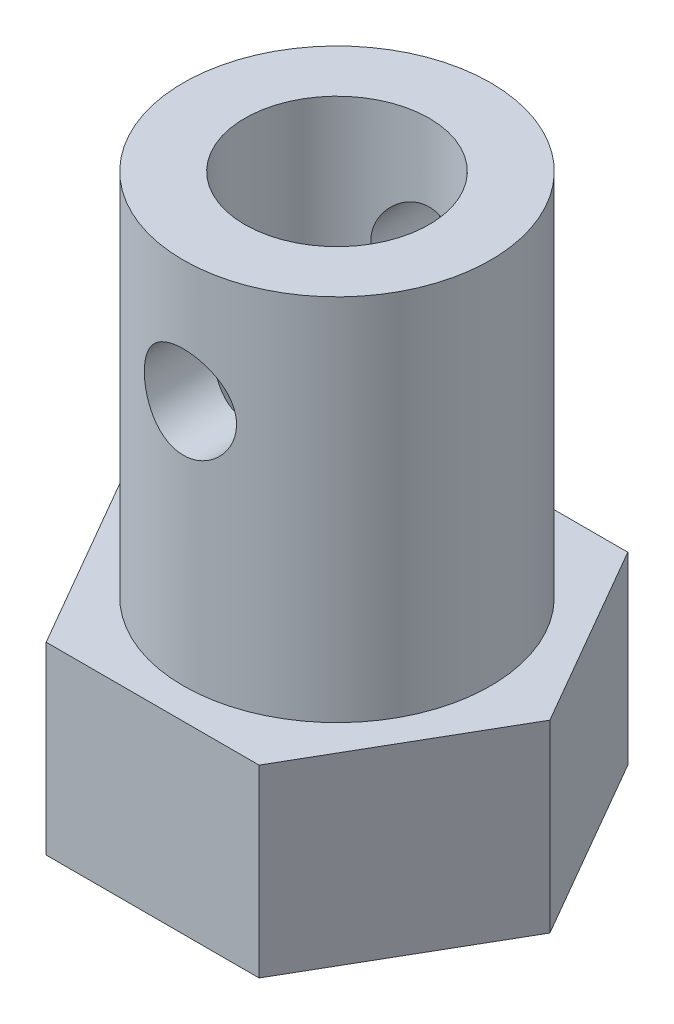
ISO-10303-21;
HEADER;
FILE_DESCRIPTION(('STEP AP214'),'2;1');
FILE_NAME('part.step','',(''),(''),'','','');
FILE_SCHEMA(('AUTOMOTIVE_DESIGN { 1 0 10303 214 1 1 1 1 }'));
ENDSEC;
DATA;
#1=APPLICATION_CONTEXT('core data for automotive mechanical design processes');
#2=APPLICATION_PROTOCOL_DEFINITION('international standard','automotive_design',2000,#1);
#3=PRODUCT_CONTEXT('',#1,'mechanical');
#4=PRODUCT('Part','Part','',(#3));
#5=PRODUCT_RELATED_PRODUCT_CATEGORY('part','',(#4));
#6=PRODUCT_DEFINITION_FORMATION('','',#4);
#7=PRODUCT_DEFINITION_CONTEXT('part definition',#1,'design');
#8=PRODUCT_DEFINITION('design','',#6,#7);
#9=PRODUCT_DEFINITION_SHAPE('','',#8);
#10=(LENGTH_UNIT() NAMED_UNIT(*) SI_UNIT(.MILLI.,.METRE.));
#11=(NAMED_UNIT(*) PLANE_ANGLE_UNIT() SI_UNIT($,.RADIAN.));
#12=(NAMED_UNIT(*) SI_UNIT($,.STERADIAN.) SOLID_ANGLE_UNIT());
#13=UNCERTAINTY_MEASURE_WITH_UNIT(LENGTH_MEASURE(1.E-05),#10,'distance_accuracy_value','');
#14=(GEOMETRIC_REPRESENTATION_CONTEXT(3) GLOBAL_UNCERTAINTY_ASSIGNED_CONTEXT((#13)) GLOBAL_UNIT_ASSIGNED_CONTEXT((#10,
#11,#12)) REPRESENTATION_CONTEXT('',''));
#15=CARTESIAN_POINT('',(0.,0.,0.));
#16=DIRECTION('',(0.,0.,1.));
#17=DIRECTION('',(1.,0.,0.));
#18=AXIS2_PLACEMENT_3D('',#15,#16,#17);
#19=CARTESIAN_POINT('',(3.46410161513783,6.,5.99999999999996));
#20=DIRECTION('',(-0.866025403784441,0.,-0.499999999999995));
#21=DIRECTION('',(-0.499999999999995,0.,0.866025403784442));
#22=AXIS2_PLACEMENT_3D('',#19,#20,#21);
#23=PLANE('',#22);
#24=DIRECTION('',(0.499999999999995,0.,-0.866025403784442));
#25=VECTOR('',#24,1.);
#26=CARTESIAN_POINT('',(3.46410161513783,0.,5.99999999999996));
#27=LINE('',#26,#25);
#28=CARTESIAN_POINT('',(3.46410161513783,0.,5.99999999999996));
#29=VERTEX_POINT('',#28);
#30=CARTESIAN_POINT('',(6.92820323027551,0.,0.));
#31=VERTEX_POINT('',#30);
#32=EDGE_CURVE('E119',#29,#31,#27,.T.);
#33=ORIENTED_EDGE('',*,*,#32,.T.);
#34=DIRECTION('',(0.,-1.,0.));
#35=VECTOR('',#34,1.);
#36=CARTESIAN_POINT('',(6.92820323027551,6.,0.));
#37=LINE('',#36,#35);
#38=CARTESIAN_POINT('',(6.92820323027551,6.,0.));
#39=VERTEX_POINT('',#38);
#40=EDGE_CURVE('E41',#39,#31,#37,.T.);
#41=ORIENTED_EDGE('',*,*,#40,.F.);
#42=DIRECTION('',(0.499999999999995,0.,-0.866025403784442));
#43=VECTOR('',#42,1.);
#44=CARTESIAN_POINT('',(3.46410161513783,6.,5.99999999999996));
#45=LINE('',#44,#43);
#46=CARTESIAN_POINT('',(3.46410161513783,6.,5.99999999999996));
#47=VERTEX_POINT('',#46);
#48=EDGE_CURVE('E130',#47,#39,#45,.T.);
#49=ORIENTED_EDGE('',*,*,#48,.F.);
#50=DIRECTION('',(0.,-1.,0.));
#51=VECTOR('',#50,1.);
#52=CARTESIAN_POINT('',(3.46410161513783,6.,5.99999999999996));
#53=LINE('',#52,#51);
#54=EDGE_CURVE('E115',#47,#29,#53,.T.);
#55=ORIENTED_EDGE('',*,*,#54,.T.);
#56=EDGE_LOOP('',(#33,#41,#49,#55));
#57=FACE_BOUND('',#56,.T.);
#58=ADVANCED_FACE('F32',(#57),#23,.F.);
#59=CARTESIAN_POINT('',(6.92820323027551,6.,0.));
#60=DIRECTION('',(-0.866025403784438,0.,0.500000000000001));
#61=DIRECTION('',(0.500000000000001,0.,0.866025403784438));
#62=AXIS2_PLACEMENT_3D('',#59,#60,#61);
#63=PLANE('',#62);
#64=DIRECTION('',(-0.500000000000001,0.,-0.866025403784438));
#65=VECTOR('',#64,1.);
#66=CARTESIAN_POINT('',(6.92820323027551,0.,0.));
#67=LINE('',#66,#65);
#68=CARTESIAN_POINT('',(3.46410161513774,0.,-6.00000000000001));
#69=VERTEX_POINT('',#68);
#70=EDGE_CURVE('E122',#31,#69,#67,.T.);
#71=ORIENTED_EDGE('',*,*,#70,.T.);
#72=DIRECTION('',(0.,-1.,0.));
#73=VECTOR('',#72,1.);
#74=CARTESIAN_POINT('',(3.46410161513774,6.,-6.00000000000001));
#75=LINE('',#74,#73);
#76=CARTESIAN_POINT('',(3.46410161513774,6.,-6.00000000000001));
#77=VERTEX_POINT('',#76);
#78=EDGE_CURVE('E134',#77,#69,#75,.T.);
#79=ORIENTED_EDGE('',*,*,#78,.F.);
#80=DIRECTION('',(-0.500000000000001,0.,-0.866025403784438));
#81=VECTOR('',#80,1.);
#82=CARTESIAN_POINT('',(6.92820323027551,6.,0.));
#83=LINE('',#82,#81);
#84=EDGE_CURVE('E88',#39,#77,#83,.T.);
#85=ORIENTED_EDGE('',*,*,#84,.F.);
#86=ORIENTED_EDGE('',*,*,#40,.T.);
#87=EDGE_LOOP('',(#71,#79,#85,#86));
#88=FACE_BOUND('',#87,.T.);
#89=ADVANCED_FACE('F202',(#88),#63,.F.);
#90=CARTESIAN_POINT('',(3.46410161513774,6.,-6.00000000000001));
#91=DIRECTION('',(0.,0.,1.));
#92=DIRECTION('',(1.,0.,0.));
#93=AXIS2_PLACEMENT_3D('',#90,#91,#92);
#94=PLANE('',#93);
#95=DIRECTION('',(-1.,0.,0.));
#96=VECTOR('',#95,1.);
#97=CARTESIAN_POINT('',(3.46410161513774,0.,-6.00000000000001));
#98=LINE('',#97,#96);
#99=CARTESIAN_POINT('',(-3.46410161513779,0.,-5.99999999999999));
#100=VERTEX_POINT('',#99);
#101=EDGE_CURVE('E125',#69,#100,#98,.T.);
#102=ORIENTED_EDGE('',*,*,#101,.T.);
#103=DIRECTION('',(0.,-1.,0.));
#104=VECTOR('',#103,1.);
#105=CARTESIAN_POINT('',(-3.46410161513779,6.,-5.99999999999999));
#106=LINE('',#105,#104);
#107=CARTESIAN_POINT('',(-3.46410161513779,6.,-5.99999999999999));
#108=VERTEX_POINT('',#107);
#109=EDGE_CURVE('E110',#108,#100,#106,.T.);
#110=ORIENTED_EDGE('',*,*,#109,.F.);
#111=DIRECTION('',(-1.,0.,0.));
#112=VECTOR('',#111,1.);
#113=CARTESIAN_POINT('',(3.46410161513774,6.,-6.00000000000001));
#114=LINE('',#113,#112);
#115=EDGE_CURVE('E101',#77,#108,#114,.T.);
#116=ORIENTED_EDGE('',*,*,#115,.F.);
#117=ORIENTED_EDGE('',*,*,#78,.T.);
#118=EDGE_LOOP('',(#102,#110,#116,#117));
#119=FACE_BOUND('',#118,.T.);
#120=ADVANCED_FACE('F200',(#119),#94,.F.);
#121=CARTESIAN_POINT('',(-3.46410161513779,6.,-5.99999999999999));
#122=DIRECTION('',(0.866025403784441,0.,0.499999999999995));
#123=DIRECTION('',(0.499999999999995,0.,-0.866025403784442));
#124=AXIS2_PLACEMENT_3D('',#121,#122,#123);
#125=PLANE('',#124);
#126=DIRECTION('',(-0.499999999999995,0.,0.866025403784442));
#127=VECTOR('',#126,1.);
#128=CARTESIAN_POINT('',(-3.46410161513779,0.,-5.99999999999999));
#129=LINE('',#128,#127);
#130=CARTESIAN_POINT('',(-6.92820323027551,0.,0.));
#131=VERTEX_POINT('',#130);
#132=EDGE_CURVE('E109',#100,#131,#129,.T.);
#133=ORIENTED_EDGE('',*,*,#132,.T.);
#134=DIRECTION('',(0.,-1.,0.));
#135=VECTOR('',#134,1.);
#136=CARTESIAN_POINT('',(-6.92820323027551,6.,0.));
#137=LINE('',#136,#135);
#138=CARTESIAN_POINT('',(-6.92820323027551,6.,0.));
#139=VERTEX_POINT('',#138);
#140=EDGE_CURVE('E106',#139,#131,#137,.T.);
#141=ORIENTED_EDGE('',*,*,#140,.F.);
#142=DIRECTION('',(-0.499999999999995,0.,0.866025403784442));
#143=VECTOR('',#142,1.);
#144=CARTESIAN_POINT('',(-3.46410161513779,6.,-5.99999999999999));
#145=LINE('',#144,#143);
#146=EDGE_CURVE('E95',#108,#139,#145,.T.);
#147=ORIENTED_EDGE('',*,*,#146,.F.);
#148=ORIENTED_EDGE('',*,*,#109,.T.);
#149=EDGE_LOOP('',(#133,#141,#147,#148));
#150=FACE_BOUND('',#149,.T.);
#151=ADVANCED_FACE('F107',(#150),#125,.F.);
#152=CARTESIAN_POINT('',(-6.92820323027551,6.,0.));
#153=DIRECTION('',(0.866025403784435,0.,-0.500000000000007));
#154=DIRECTION('',(-0.500000000000007,0.,-0.866025403784434));
#155=AXIS2_PLACEMENT_3D('',#152,#153,#154);
#156=PLANE('',#155);
#157=DIRECTION('',(0.500000000000007,0.,0.866025403784435));
#158=VECTOR('',#157,1.);
#159=CARTESIAN_POINT('',(-6.92820323027551,0.,0.));
#160=LINE('',#159,#158);
#161=CARTESIAN_POINT('',(-3.4641016151377,0.,6.00000000000004));
#162=VERTEX_POINT('',#161);
#163=EDGE_CURVE('E73',#131,#162,#160,.T.);
#164=ORIENTED_EDGE('',*,*,#163,.T.);
#165=DIRECTION('',(0.,-1.,0.));
#166=VECTOR('',#165,1.);
#167=CARTESIAN_POINT('',(-3.4641016151377,6.,6.00000000000004));
#168=LINE('',#167,#166);
#169=CARTESIAN_POINT('',(-3.4641016151377,6.,6.00000000000004));
#170=VERTEX_POINT('',#169);
#171=EDGE_CURVE('E111',#170,#162,#168,.T.);
#172=ORIENTED_EDGE('',*,*,#171,.F.);
#173=DIRECTION('',(0.500000000000007,0.,0.866025403784435));
#174=VECTOR('',#173,1.);
#175=CARTESIAN_POINT('',(-6.92820323027551,6.,0.));
#176=LINE('',#175,#174);
#177=EDGE_CURVE('E99',#139,#170,#176,.T.);
#178=ORIENTED_EDGE('',*,*,#177,.F.);
#179=ORIENTED_EDGE('',*,*,#140,.T.);
#180=EDGE_LOOP('',(#164,#172,#178,#179));
#181=FACE_BOUND('',#180,.T.);
#182=ADVANCED_FACE('F113',(#181),#156,.F.);
#183=CARTESIAN_POINT('',(-3.4641016151377,6.,6.00000000000004));
#184=DIRECTION('',(0.,0.,-1.));
#185=DIRECTION('',(-1.,0.,0.));
#186=AXIS2_PLACEMENT_3D('',#183,#184,#185);
#187=PLANE('',#186);
#188=DIRECTION('',(1.,0.,0.));
#189=VECTOR('',#188,1.);
#190=CARTESIAN_POINT('',(-3.4641016151377,0.,6.00000000000004));
#191=LINE('',#190,#189);
#192=EDGE_CURVE('E79',#162,#29,#191,.T.);
#193=ORIENTED_EDGE('',*,*,#192,.T.);
#194=ORIENTED_EDGE('',*,*,#54,.F.);
#195=DIRECTION('',(1.,0.,0.));
#196=VECTOR('',#195,1.);
#197=CARTESIAN_POINT('',(-3.4641016151377,6.,6.00000000000004));
#198=LINE('',#197,#196);
#199=EDGE_CURVE('E50',#170,#47,#198,.T.);
#200=ORIENTED_EDGE('',*,*,#199,.F.);
#201=ORIENTED_EDGE('',*,*,#171,.T.);
#202=EDGE_LOOP('',(#193,#194,#200,#201));
#203=FACE_BOUND('',#202,.T.);
#204=ADVANCED_FACE('F189',(#203),#187,.F.);
#205=CARTESIAN_POINT('',(0.,6.,0.));
#206=DIRECTION('',(0.,1.,0.));
#207=DIRECTION('',(0.,0.,1.));
#208=AXIS2_PLACEMENT_3D('',#205,#206,#207);
#209=PLANE('',#208);
#210=CARTESIAN_POINT('',(0.,6.,0.));
#211=DIRECTION('',(0.,1.,0.));
#212=DIRECTION('',(0.,0.,1.));
#213=AXIS2_PLACEMENT_3D('',#210,#211,#212);
#214=CIRCLE('',#213,5.);
#215=CARTESIAN_POINT('',(0.,6.,5.));
#216=VERTEX_POINT('',#215);
#217=EDGE_CURVE('E11',#216,#216,#214,.T.);
#218=ORIENTED_EDGE('',*,*,#217,.F.);
#219=EDGE_LOOP('',(#218));
#220=FACE_BOUND('',#219,.T.);
#221=ORIENTED_EDGE('',*,*,#48,.T.);
#222=ORIENTED_EDGE('',*,*,#84,.T.);
#223=ORIENTED_EDGE('',*,*,#115,.T.);
#224=ORIENTED_EDGE('',*,*,#146,.T.);
#225=ORIENTED_EDGE('',*,*,#177,.T.);
#226=ORIENTED_EDGE('',*,*,#199,.T.);
#227=EDGE_LOOP('',(#221,#222,#223,#224,#225,#226));
#228=FACE_BOUND('',#227,.T.);
#229=ADVANCED_FACE('F97',(#220,#228),#209,.T.);
#230=CARTESIAN_POINT('',(0.,0.,0.));
#231=DIRECTION('',(0.,1.,0.));
#232=DIRECTION('',(0.,0.,1.));
#233=AXIS2_PLACEMENT_3D('',#230,#231,#232);
#234=PLANE('',#233);
#235=CARTESIAN_POINT('',(0.,0.,0.));
#236=DIRECTION('',(0.,-1.,0.));
#237=DIRECTION('',(0.,0.,-1.));
#238=AXIS2_PLACEMENT_3D('',#235,#236,#237);
#239=CIRCLE('',#238,1.5);
#240=CARTESIAN_POINT('',(0.,0.,-1.5));
#241=VERTEX_POINT('',#240);
#242=EDGE_CURVE('E174',#241,#241,#239,.T.);
#243=ORIENTED_EDGE('',*,*,#242,.F.);
#244=EDGE_LOOP('',(#243));
#245=FACE_BOUND('',#244,.T.);
#246=ORIENTED_EDGE('',*,*,#32,.F.);
#247=ORIENTED_EDGE('',*,*,#192,.F.);
#248=ORIENTED_EDGE('',*,*,#163,.F.);
#249=ORIENTED_EDGE('',*,*,#132,.F.);
#250=ORIENTED_EDGE('',*,*,#101,.F.);
#251=ORIENTED_EDGE('',*,*,#70,.F.);
#252=EDGE_LOOP('',(#246,#247,#248,#249,#250,#251));
#253=FACE_BOUND('',#252,.T.);
#254=ADVANCED_FACE('F184',(#245,#253),#234,.F.);
#255=CARTESIAN_POINT('',(0.,18.,0.));
#256=DIRECTION('',(0.,-1.,0.));
#257=DIRECTION('',(0.,0.,-1.));
#258=AXIS2_PLACEMENT_3D('',#255,#256,#257);
#259=CYLINDRICAL_SURFACE('',#258,5.);
#260=CARTESIAN_POINT('',(0.,15.5,-5.));
#261=CARTESIAN_POINT('',(-0.0822886127532999,15.4999990025151,-4.9999992925055));
#262=CARTESIAN_POINT('',(-0.164587318351529,15.493206136376,-4.99794915693954));
#263=CARTESIAN_POINT('',(-0.326788125304881,15.4662786457779,-4.98997105593691));
#264=CARTESIAN_POINT('',(-0.40668950441142,15.4461400419767,-4.98404193389692));
#265=CARTESIAN_POINT('',(-0.561732707754526,15.3932539830897,-4.96895552501836));
#266=CARTESIAN_POINT('',(-0.636881364395372,15.3605251303811,-4.95980300250425));
#267=CARTESIAN_POINT('',(-0.78062418105313,15.2834639069442,-4.93922109237645));
#268=CARTESIAN_POINT('',(-0.849217467469669,15.2391299926046,-4.92779140192067));
#269=CARTESIAN_POINT('',(-0.979871797183745,15.1387759925273,-4.90350737192774));
#270=CARTESIAN_POINT('',(-1.04171807124434,15.0824833741141,-4.89062383657036));
#271=CARTESIAN_POINT('',(-1.15524920923324,14.9603907700898,-4.86505834210442));
#272=CARTESIAN_POINT('',(-1.20693236327441,14.894589187875,-4.85237641724501));
#273=CARTESIAN_POINT('',(-1.29980037723708,14.7535292469624,-4.82834113993772));
#274=CARTESIAN_POINT('',(-1.34072309022213,14.6780915390093,-4.81702406663875));
#275=CARTESIAN_POINT('',(-1.4092139477476,14.5210107457697,-4.79743620394031));
#276=CARTESIAN_POINT('',(-1.43678529919973,14.439369156072,-4.78916468313311));
#277=CARTESIAN_POINT('',(-1.47701633682652,14.2746097338695,-4.77690870838434));
#278=CARTESIAN_POINT('',(-1.49007196234677,14.1915972561361,-4.77281069324533));
#279=CARTESIAN_POINT('',(-1.50213730614672,14.0244668437832,-4.76902789749767));
#280=CARTESIAN_POINT('',(-1.50115042761078,13.9403491819409,-4.76934204760571));
#281=CARTESIAN_POINT('',(-1.48546977199812,13.7766160913915,-4.77424744067778));
#282=CARTESIAN_POINT('',(-1.47127205262685,13.6969477496378,-4.7786838859914));
#283=CARTESIAN_POINT('',(-1.43037420427056,13.5411802137265,-4.79108356228624));
#284=CARTESIAN_POINT('',(-1.40367284141641,13.4650813726257,-4.79904714132351));
#285=CARTESIAN_POINT('',(-1.33816026653682,13.3173996503393,-4.81772733074973));
#286=CARTESIAN_POINT('',(-1.29918816934643,13.2458929160447,-4.82848016115952));
#287=CARTESIAN_POINT('',(-1.21035222588683,13.1102679779898,-4.85150987000065));
#288=CARTESIAN_POINT('',(-1.16048574002588,13.0461515705862,-4.86378711746991));
#289=CARTESIAN_POINT('',(-1.04881290765546,12.924313809238,-4.88911011297937));
#290=CARTESIAN_POINT('',(-0.986594907466973,12.8669713359703,-4.90216654310498));
#291=CARTESIAN_POINT('',(-0.853263259313967,12.7634460159358,-4.92712244063259));
#292=CARTESIAN_POINT('',(-0.782149051860888,12.7172638715856,-4.9390218351841));
#293=CARTESIAN_POINT('',(-0.632355038342803,12.6371400775353,-4.9604316006947));
#294=CARTESIAN_POINT('',(-0.55362774974795,12.6032824837501,-4.96992543668314));
#295=CARTESIAN_POINT('',(-0.39124541560352,12.5494004099004,-4.98533521832222));
#296=CARTESIAN_POINT('',(-0.307591751589582,12.5293720714675,-4.99125216186999));
#297=CARTESIAN_POINT('',(-0.140952242668333,12.5043478221006,-4.99868364643538));
#298=CARTESIAN_POINT('',(-0.0580500976011877,12.4988384141984,-5.0003485041779));
#299=CARTESIAN_POINT('',(0.107499605823383,12.5015691557121,-4.9995292324176));
#300=CARTESIAN_POINT('',(0.19014719669078,12.5098074696514,-4.99704565677756));
#301=CARTESIAN_POINT('',(0.350903605309696,12.5393846111115,-4.98830696987163));
#302=CARTESIAN_POINT('',(0.429072772614169,12.5604233875809,-4.98213829799417));
#303=CARTESIAN_POINT('',(0.580754638954521,12.6146432327782,-4.96674347841533));
#304=CARTESIAN_POINT('',(0.654266777025583,12.6478257610379,-4.95751696321085));
#305=CARTESIAN_POINT('',(0.796437189461052,12.7262531654811,-4.93669654351325));
#306=CARTESIAN_POINT('',(0.864943826199669,12.771759340948,-4.92505280829675));
#307=CARTESIAN_POINT('',(0.993523307980146,12.8732247540528,-4.90073468764318));
#308=CARTESIAN_POINT('',(1.05359403235593,12.9291866118877,-4.8880600443108));
#309=CARTESIAN_POINT('',(1.16585744551027,13.0523873083693,-4.86253171869138));
#310=CARTESIAN_POINT('',(1.21768481231503,13.1199618757717,-4.84968825033268));
#311=CARTESIAN_POINT('',(1.30928995072153,13.2631279390135,-4.82576515238463));
#312=CARTESIAN_POINT('',(1.34906803829472,13.3387192245582,-4.81468547654651));
#313=CARTESIAN_POINT('',(1.41517347127168,13.4955324912547,-4.79567189615055));
#314=CARTESIAN_POINT('',(1.4415634693705,13.5767261865366,-4.78772337843827));
#315=CARTESIAN_POINT('',(1.48021730815114,13.7426879689315,-4.77591594362794));
#316=CARTESIAN_POINT('',(1.49248598978779,13.8274548207877,-4.772055625083));
#317=CARTESIAN_POINT('',(1.50221984485059,13.9943615183762,-4.76899972496087));
#318=CARTESIAN_POINT('',(1.5002805530849,14.0764636510176,-4.76961647442755));
#319=CARTESIAN_POINT('',(1.48307505444813,14.2391141033728,-4.77499401288294));
#320=CARTESIAN_POINT('',(1.46780938124716,14.3196624851764,-4.77975463592551));
#321=CARTESIAN_POINT('',(1.42476888804136,14.4759453991429,-4.79275763670385));
#322=CARTESIAN_POINT('',(1.39715175507068,14.5517272873617,-4.80095604545965));
#323=CARTESIAN_POINT('',(1.33031507121129,14.6976424388177,-4.81990278909136));
#324=CARTESIAN_POINT('',(1.29109329962876,14.7677746176408,-4.83065161194312));
#325=CARTESIAN_POINT('',(1.20048763805072,14.9031631165271,-4.85397676425833));
#326=CARTESIAN_POINT('',(1.14871276092994,14.9681487612604,-4.86660540163798));
#327=CARTESIAN_POINT('',(1.03517434629782,15.0887024983079,-4.89201320450026));
#328=CARTESIAN_POINT('',(0.973408217134502,15.1442681394678,-4.90479240823905));
#329=CARTESIAN_POINT('',(0.839465762183249,15.246023412295,-4.92950936570649));
#330=CARTESIAN_POINT('',(0.767037885790608,15.2918914468555,-4.94141159765674));
#331=CARTESIAN_POINT('',(0.61514137398353,15.370735169904,-4.96260680455813));
#332=CARTESIAN_POINT('',(0.535676052998955,15.4037168882745,-4.97190099931067));
#333=CARTESIAN_POINT('',(0.380757712655282,15.4528952756528,-4.98602174969301));
#334=CARTESIAN_POINT('',(0.305786961954235,15.4705116728832,-4.99122027381068));
#335=CARTESIAN_POINT('',(0.15388019523078,15.4940635252416,-4.99820944494492));
#336=CARTESIAN_POINT('',(0.0769445098581397,15.5000009327048,-5.0000006615474));
#337=CARTESIAN_POINT('',(0.,15.5,-5.));
#338=B_SPLINE_CURVE_WITH_KNOTS('',3,(#260,#261,#262,#263,#264,#265,#266,#267,#268,#269,#270,
#271,#272,#273,#274,#275,#276,#277,#278,#279,#280,#281,#282,#283,#284,#285,#286,#287,#288,#289,
#290,#291,#292,#293,#294,#295,#296,#297,#298,#299,#300,#301,#302,#303,#304,#305,#306,#307,#308,
#309,#310,#311,#312,#313,#314,#315,#316,#317,#318,#319,#320,#321,#322,#323,#324,#325,#326,#327,
#328,#329,#330,#331,#332,#333,#334,#335,#336,#337),.UNSPECIFIED.,.T.,.F.,(4,2,2,2,2,2,2,2,2,2,2,
2,2,2,2,2,2,2,2,2,2,2,2,2,2,2,2,2,2,2,2,2,2,2,2,2,2,2,4),(0.,0.24658320361261,0.493239964845999,
0.739533676300873,0.9858601644127,1.23855602948191,1.49129437288633,1.74971481004109,
2.00807314543223,2.25919689356599,2.51025978319089,2.75226016697676,2.99428443658001,
3.23962426447119,3.48502360158555,3.74067104048166,3.99633456531071,4.25371046881688,
4.51101453528807,4.75908809438545,5.00712853550327,5.24956746682327,5.49203554593728,
5.74011305702908,5.98825282000191,6.24540400322818,6.5025484425268,6.75847814951252,
7.01432009460283,7.25950155466943,7.504673196616,7.74680040402721,7.98897397553107,
8.2399692567993,8.49102974897502,8.74942996156671,9.00770911595235,9.23831691930459,
9.46888616948874),.UNSPECIFIED.);
#339=CARTESIAN_POINT('',(0.,15.5,-5.));
#340=VERTEX_POINT('',#339);
#341=EDGE_CURVE('E173',#340,#340,#338,.T.);
#342=ORIENTED_EDGE('',*,*,#341,.T.);
#343=EDGE_LOOP('',(#342));
#344=FACE_BOUND('',#343,.T.);
#345=CARTESIAN_POINT('',(1.5,14.,4.76969600708473));
#346=CARTESIAN_POINT('',(1.49999897633764,13.9178054520576,4.7696968572698));
#347=CARTESIAN_POINT('',(1.49322108167142,13.835600775856,4.77184390209069));
#348=CARTESIAN_POINT('',(1.46635844446749,13.6735947504081,4.780165783029));
#349=CARTESIAN_POINT('',(1.44626925573578,13.5937942134985,4.78634196493468));
#350=CARTESIAN_POINT('',(1.39352753269955,13.4389652717283,4.80196102485632));
#351=CARTESIAN_POINT('',(1.36089589394243,13.3639291703669,4.81139846703232));
#352=CARTESIAN_POINT('',(1.28406421917929,13.2203780660047,4.83246932547567));
#353=CARTESIAN_POINT('',(1.23986245137053,13.1518640413156,4.84410307041019));
#354=CARTESIAN_POINT('',(1.13964754141627,13.0211336094226,4.86866862185765));
#355=CARTESIAN_POINT('',(1.08333207175807,12.9591541020537,4.88162808311636));
#356=CARTESIAN_POINT('',(0.9611362375796,12.8453620486775,4.90714861936757));
#357=CARTESIAN_POINT('',(0.895254645461113,12.7935508095501,4.91970964297705));
#358=CARTESIAN_POINT('',(0.754111437793691,12.7005373001667,4.94333214579389));
#359=CARTESIAN_POINT('',(0.678684021335815,12.6595765755572,4.95435724342404));
#360=CARTESIAN_POINT('',(0.521624645369355,12.5910127409572,4.97334435920684));
#361=CARTESIAN_POINT('',(0.439994028387912,12.5634067501426,4.98130703789495));
#362=CARTESIAN_POINT('',(0.27532385263083,12.5231199989095,4.99307646003589));
#363=CARTESIAN_POINT('',(0.192391398953802,12.5100348723473,4.99699557369338));
#364=CARTESIAN_POINT('',(0.0254218237493159,12.4978826753536,5.00063201501348));
#365=CARTESIAN_POINT('',(-0.0586150620503671,12.498812660598,5.00035022521079));
#366=CARTESIAN_POINT('',(-0.222571156600159,12.514392868543,4.99569603817659));
#367=CARTESIAN_POINT('',(-0.30253626764134,12.5286051938099,4.9914542020526));
#368=CARTESIAN_POINT('',(-0.458889213442525,12.5696313359943,4.97951522112593));
#369=CARTESIAN_POINT('',(-0.535276821322845,12.5964459509427,4.97181785750586));
#370=CARTESIAN_POINT('',(-0.683347326351279,12.6622120234186,4.95365220986963));
#371=CARTESIAN_POINT('',(-0.754965064694476,12.7013012028073,4.94315269676706));
#372=CARTESIAN_POINT('',(-0.890764673783154,12.7903978524282,4.92049640648069));
#373=CARTESIAN_POINT('',(-0.95494477487213,12.8404079129635,4.90833923637778));
#374=CARTESIAN_POINT('',(-1.0766604815298,12.9521977507516,4.88311550488166));
#375=CARTESIAN_POINT('',(-1.13384458040111,13.0143569190297,4.87003195321461));
#376=CARTESIAN_POINT('',(-1.23707651539823,13.1475100178901,4.84483979887497));
#377=CARTESIAN_POINT('',(-1.28312324482852,13.2185048253892,4.8327312931702));
#378=CARTESIAN_POINT('',(-1.3631399533545,13.368239469249,4.81077903197678));
#379=CARTESIAN_POINT('',(-1.39698989237679,13.4470470458629,4.80095810695957));
#380=CARTESIAN_POINT('',(-1.45083362878413,13.6096072084455,4.78496392548436));
#381=CARTESIAN_POINT('',(-1.4708319464056,13.6933581715346,4.7787894791583));
#382=CARTESIAN_POINT('',(-1.49574770282165,13.8600823607393,4.77104849541241));
#383=CARTESIAN_POINT('',(-1.50119946380212,13.942968223894,4.76931878670441));
#384=CARTESIAN_POINT('',(-1.49835947233062,14.1084729000099,4.77021192441924));
#385=CARTESIAN_POINT('',(-1.4900696437133,14.1910917487308,4.77283416156589));
#386=CARTESIAN_POINT('',(-1.4604576357419,14.3514883779709,4.78197558554912));
#387=CARTESIAN_POINT('',(-1.4394796143128,14.4293361642635,4.78839176507489));
#388=CARTESIAN_POINT('',(-1.3854857774794,14.5804016908149,4.80429141231227));
#389=CARTESIAN_POINT('',(-1.3524681034276,14.6536187141406,4.81377535359073));
#390=CARTESIAN_POINT('',(-1.27431871196501,14.7955174640721,4.83505835023047));
#391=CARTESIAN_POINT('',(-1.22888564172729,14.8640247209858,4.84691271069799));
#392=CARTESIAN_POINT('',(-1.12755301600385,14.9926381061808,4.87148205646987));
#393=CARTESIAN_POINT('',(-1.07165095534897,15.0527422176128,4.88419724730003));
#394=CARTESIAN_POINT('',(-0.948455132493601,15.1651804058147,4.90963633548158));
#395=CARTESIAN_POINT('',(-0.880811065857436,15.217135628987,4.92234245063004));
#396=CARTESIAN_POINT('',(-0.737461784590251,15.3089667010277,4.94584851748651));
#397=CARTESIAN_POINT('',(-0.661756970543946,15.3488431497815,4.95664856384717));
#398=CARTESIAN_POINT('',(-0.504935504705224,15.4150000305683,4.97505970474957));
#399=CARTESIAN_POINT('',(-0.423864622037841,15.441382016159,4.98269453424966));
#400=CARTESIAN_POINT('',(-0.25816996650459,15.4800609188904,4.99401979596827));
#401=CARTESIAN_POINT('',(-0.173547217354765,15.4923618659484,4.9977113567088));
#402=CARTESIAN_POINT('',(-0.00665215388274525,15.5022230440545,5.00066544081399));
#403=CARTESIAN_POINT('',(0.0755851790862042,15.5003326954078,5.00009305111322));
#404=CARTESIAN_POINT('',(0.238519481164402,15.4831783675009,4.99497264465037));
#405=CARTESIAN_POINT('',(0.319216537346527,15.4679151465196,4.99042485330463));
#406=CARTESIAN_POINT('',(0.475935813041356,15.4247883386004,4.97791168358327));
#407=CARTESIAN_POINT('',(0.55199892735139,15.397061819351,4.96998352900866));
#408=CARTESIAN_POINT('',(0.698433237752052,15.3299180854928,4.9515294303945));
#409=CARTESIAN_POINT('',(0.768803496050578,15.2904989497138,4.94100305949946));
#410=CARTESIAN_POINT('',(0.904301892420561,15.19962654257,4.91803965828228));
#411=CARTESIAN_POINT('',(0.969190250076764,15.1478285699992,4.90555226923559));
#412=CARTESIAN_POINT('',(1.08953757134594,15.0342896116672,4.88023537212334));
#413=CARTESIAN_POINT('',(1.14499380960193,14.9725457621019,4.86740576641079));
#414=CARTESIAN_POINT('',(1.24656269394549,14.8386592216895,4.84240680631319));
#415=CARTESIAN_POINT('',(1.29234759757956,14.7662614466096,4.83026852693485));
#416=CARTESIAN_POINT('',(1.37104313528776,14.614444825839,4.80852547508793));
#417=CARTESIAN_POINT('',(1.40395995557288,14.5350293763988,4.79891948596956));
#418=CARTESIAN_POINT('',(1.45301942532949,14.3802595683937,4.78427816717595));
#419=CARTESIAN_POINT('',(1.47058859011232,14.305391353069,4.7788615484052));
#420=CARTESIAN_POINT('',(1.49407818835144,14.1536847775042,4.77157042597167));
#421=CARTESIAN_POINT('',(1.50000095706095,14.0768468153548,4.7696952122143));
#422=CARTESIAN_POINT('',(1.5,14.,4.76969600708473));
#423=B_SPLINE_CURVE_WITH_KNOTS('',3,(#345,#346,#347,#348,#349,#350,#351,#352,#353,#354,#355,
#356,#357,#358,#359,#360,#361,#362,#363,#364,#365,#366,#367,#368,#369,#370,#371,#372,#373,#374,
#375,#376,#377,#378,#379,#380,#381,#382,#383,#384,#385,#386,#387,#388,#389,#390,#391,#392,#393,
#394,#395,#396,#397,#398,#399,#400,#401,#402,#403,#404,#405,#406,#407,#408,#409,#410,#411,#412,
#413,#414,#415,#416,#417,#418,#419,#420,#421,#422),.UNSPECIFIED.,.T.,.F.,(4,2,2,2,2,2,2,2,2,2,2,
2,2,2,2,2,2,2,2,2,2,2,2,2,2,2,2,2,2,2,2,2,2,2,2,2,2,2,4),(0.,0.24630016591554,0.492682641688999,
0.738656414466193,0.9846670253701,1.23773150007984,1.49082847871273,1.74915939273644,
2.00743455587877,2.25832140149558,2.5091555410144,2.7520012599088,2.99486235890376,
3.24055209335676,3.4863001659083,3.74152147023278,3.99676812491863,4.25446238246266,
4.51207250628411,4.76008080790309,5.00805439107387,5.24958594938817,5.49115481045787,
5.73920731809388,5.98731925928922,6.24479506100602,6.50225807324202,6.75775391814325,
7.01317662321682,7.2587630391122,7.50433553047754,7.74727096872219,7.99024634491378,
8.24099627054488,8.4918185262989,8.75011639669147,9.00828993963944,9.23861153857448,
9.4688869503356),.UNSPECIFIED.);
#424=CARTESIAN_POINT('',(1.5,14.,4.76969600708473));
#425=VERTEX_POINT('',#424);
#426=EDGE_CURVE('E166',#425,#425,#423,.T.);
#427=ORIENTED_EDGE('',*,*,#426,.T.);
#428=EDGE_LOOP('',(#427));
#429=FACE_BOUND('',#428,.T.);
#430=CARTESIAN_POINT('',(0.,18.,0.));
#431=DIRECTION('',(0.,1.,0.));
#432=DIRECTION('',(0.,0.,1.));
#433=AXIS2_PLACEMENT_3D('',#430,#431,#432);
#434=CIRCLE('',#433,5.);
#435=CARTESIAN_POINT('',(0.,18.,5.));
#436=VERTEX_POINT('',#435);
#437=EDGE_CURVE('E123',#436,#436,#434,.T.);
#438=ORIENTED_EDGE('',*,*,#437,.F.);
#439=EDGE_LOOP('',(#438));
#440=FACE_BOUND('',#439,.T.);
#441=ORIENTED_EDGE('',*,*,#217,.T.);
#442=EDGE_LOOP('',(#441));
#443=FACE_BOUND('',#442,.T.);
#444=ADVANCED_FACE('F179',(#344,#429,#440,#443),#259,.T.);
#445=CARTESIAN_POINT('',(0.,18.,0.));
#446=DIRECTION('',(0.,1.,0.));
#447=DIRECTION('',(0.,0.,1.));
#448=AXIS2_PLACEMENT_3D('',#445,#446,#447);
#449=PLANE('',#448);
#450=CARTESIAN_POINT('',(0.,18.,0.));
#451=DIRECTION('',(0.,1.,0.));
#452=DIRECTION('',(0.,0.,1.));
#453=AXIS2_PLACEMENT_3D('',#450,#451,#452);
#454=CIRCLE('',#453,3.);
#455=CARTESIAN_POINT('',(0.,18.,3.));
#456=VERTEX_POINT('',#455);
#457=EDGE_CURVE('E220',#456,#456,#454,.T.);
#458=ORIENTED_EDGE('',*,*,#457,.F.);
#459=EDGE_LOOP('',(#458));
#460=FACE_BOUND('',#459,.T.);
#461=ORIENTED_EDGE('',*,*,#437,.T.);
#462=EDGE_LOOP('',(#461));
#463=FACE_BOUND('',#462,.T.);
#464=ADVANCED_FACE('F183',(#460,#463),#449,.T.);
#465=CARTESIAN_POINT('',(0.,3.6,0.));
#466=DIRECTION('',(0.,1.,0.));
#467=DIRECTION('',(0.,0.,1.));
#468=AXIS2_PLACEMENT_3D('',#465,#466,#467);
#469=CYLINDRICAL_SURFACE('',#468,3.);
#470=CARTESIAN_POINT('',(0.,12.5,3.));
#471=CARTESIAN_POINT('',(0.0788579444268504,12.5000049534758,2.99999570107562));
#472=CARTESIAN_POINT('',(0.157809899546344,12.5062551096816,2.99685736529635));
#473=CARTESIAN_POINT('',(0.313380352903345,12.5309793205123,2.98461234055736));
#474=CARTESIAN_POINT('',(0.389994130070445,12.5494765894967,2.97549431743379));
#475=CARTESIAN_POINT('',(0.538400317320674,12.5977907129249,2.95224419105063));
#476=CARTESIAN_POINT('',(0.61021020440872,12.627563576372,2.93813158766306));
#477=CARTESIAN_POINT('',(0.747708925209898,12.6973559320475,2.90618664773642));
#478=CARTESIAN_POINT('',(0.813398240985089,12.7373746163733,2.88835460450288));
#479=CARTESIAN_POINT('',(0.941261726642864,12.8292758742279,2.84934387387093));
#480=CARTESIAN_POINT('',(1.00298281668316,12.8817297188595,2.82802798691306));
#481=CARTESIAN_POINT('',(1.11716916730047,12.9957822188706,2.78489955370115));
#482=CARTESIAN_POINT('',(1.16962737466015,13.0573877776587,2.76308664313552));
#483=CARTESIAN_POINT('',(1.26787800067542,13.1937250242851,2.71948426796021));
#484=CARTESIAN_POINT('',(1.31283800332746,13.2691041475189,2.69782780455198));
#485=CARTESIAN_POINT('',(1.38925234033604,13.4275510039793,2.65928968158481));
#486=CARTESIAN_POINT('',(1.4207163224495,13.5106131930841,2.64240461410484));
#487=CARTESIAN_POINT('',(1.46719866328288,13.6769976581329,2.61686800556713));
#488=CARTESIAN_POINT('',(1.48308878562066,13.7600066781011,2.6077840737557));
#489=CARTESIAN_POINT('',(1.50064048996327,13.9279682566692,2.59772834922792));
#490=CARTESIAN_POINT('',(1.50231613255961,14.0129188113067,2.59674854014932));
#491=CARTESIAN_POINT('',(1.49203093075844,14.1714290364731,2.60266395385873));
#492=CARTESIAN_POINT('',(1.48167683930523,14.2451360468346,2.6086314549302));
#493=CARTESIAN_POINT('',(1.4504097735854,14.3895828640596,2.62614343100775));
#494=CARTESIAN_POINT('',(1.42949343584648,14.460321717958,2.63768968247664));
#495=CARTESIAN_POINT('',(1.37731467057901,14.5988436988485,2.66531214619112));
#496=CARTESIAN_POINT('',(1.34582260067399,14.6665195981787,2.68148760995998));
#497=CARTESIAN_POINT('',(1.27356253150201,14.795951438885,2.71655106422105));
#498=CARTESIAN_POINT('',(1.2327903657187,14.8577047034001,2.73544027170286));
#499=CARTESIAN_POINT('',(1.13709908236918,14.9817818791148,2.77669736854929));
#500=CARTESIAN_POINT('',(1.08104168755392,15.0431853103642,2.79920265355119));
#501=CARTESIAN_POINT('',(0.959333368112062,15.1561031278864,2.84321434950611));
#502=CARTESIAN_POINT('',(0.893677884861429,15.2076127880508,2.86472027938201));
#503=CARTESIAN_POINT('',(0.750774758747774,15.3015284915446,2.90552980924446));
#504=CARTESIAN_POINT('',(0.673130387399115,15.3434007086686,2.92468476243011));
#505=CARTESIAN_POINT('',(0.510699323233197,15.4131455435645,2.95736821681863));
#506=CARTESIAN_POINT('',(0.425918364397916,15.4410292775227,2.9709011841533));
#507=CARTESIAN_POINT('',(0.259149737491055,15.479713105575,2.98986500612153));
#508=CARTESIAN_POINT('',(0.177512295822491,15.4917368536202,2.99587407451965));
#509=CARTESIAN_POINT('',(0.0131693999240288,15.5021970967017,3.00109520188655));
#510=CARTESIAN_POINT('',(-0.0695355298048621,15.5006400284592,3.00031048081978));
#511=CARTESIAN_POINT('',(-0.226849457978979,15.4846899673719,2.99236788380152));
#512=CARTESIAN_POINT('',(-0.301589112074894,15.471301200905,2.98570868532253));
#513=CARTESIAN_POINT('',(-0.447610338452911,15.4336428921573,2.9673325697226));
#514=CARTESIAN_POINT('',(-0.51889152853663,15.4093721503198,2.95561509501618));
#515=CARTESIAN_POINT('',(-0.658332912674359,15.3500023003505,2.92776377120382));
#516=CARTESIAN_POINT('',(-0.726345595508704,15.3146134248256,2.91151322654446));
#517=CARTESIAN_POINT('',(-0.855692042548907,15.2343386965302,2.87615961476126));
#518=CARTESIAN_POINT('',(-0.917022944664887,15.1894487981069,2.85705533350407));
#519=CARTESIAN_POINT('',(-1.03765153393382,15.0863593620039,2.81562332004297));
#520=CARTESIAN_POINT('',(-1.09615811672854,15.0272856973323,2.79316327265249));
#521=CARTESIAN_POINT('',(-1.20278448167828,14.9001122730834,2.7489358741323));
#522=CARTESIAN_POINT('',(-1.25089707856781,14.8320063217281,2.72716901100071));
#523=CARTESIAN_POINT('',(-1.33756187171853,14.6845345187405,2.68576788309734));
#524=CARTESIAN_POINT('',(-1.37553824370037,14.6047831008583,2.66628794383591));
#525=CARTESIAN_POINT('',(-1.43712423890206,14.4387348986376,2.63361108441202));
#526=CARTESIAN_POINT('',(-1.46075237380052,14.3524467102997,2.62040607332625));
#527=CARTESIAN_POINT('',(-1.49079253120031,14.1846346656729,2.60342251538703));
#528=CARTESIAN_POINT('',(-1.49863949460818,14.1034486198471,2.59886075197597));
#529=CARTESIAN_POINT('',(-1.5010337315643,13.9408293992532,2.59748031962405));
#530=CARTESIAN_POINT('',(-1.49558676993486,13.8593963468932,2.60065829439585));
#531=CARTESIAN_POINT('',(-1.47288918838996,13.7067747476998,2.61356793076615));
#532=CARTESIAN_POINT('',(-1.45681247151455,13.6353492947829,2.62264641723988));
#533=CARTESIAN_POINT('',(-1.41476303733662,13.4962878208635,2.64556524281479));
#534=CARTESIAN_POINT('',(-1.38878713673988,13.428653026862,2.65940711354503));
#535=CARTESIAN_POINT('',(-1.32572361795085,13.2940627235202,2.69142795546803));
#536=CARTESIAN_POINT('',(-1.28800670672355,13.2274581472565,2.70983583593881));
#537=CARTESIAN_POINT('',(-1.20322645745609,13.1010881957281,2.74852997452291));
#538=CARTESIAN_POINT('',(-1.15615825686234,13.0413264042183,2.76881720693416));
#539=CARTESIAN_POINT('',(-1.04730498999206,12.922787026468,2.81193484737138));
#540=CARTESIAN_POINT('',(-0.984426634495894,12.8650113464746,2.83477474959942));
#541=CARTESIAN_POINT('',(-0.849232209349798,12.7606055248471,2.87816628389896));
#542=CARTESIAN_POINT('',(-0.776911084957798,12.7139813907951,2.89871667939293));
#543=CARTESIAN_POINT('',(-0.62389739517442,12.6331454559319,2.93547014349806));
#544=CARTESIAN_POINT('',(-0.543149255665097,12.5990237461453,2.95164144740899));
#545=CARTESIAN_POINT('',(-0.376113151707131,12.5452877483639,2.9775201194848));
#546=CARTESIAN_POINT('',(-0.289841699383652,12.5256322297914,2.98724585044602));
#547=CARTESIAN_POINT('',(-0.168902919736344,12.5091538833714,2.99543192870217));
#548=CARTESIAN_POINT('',(-0.135242819162349,12.5057260387005,2.99714048010376));
#549=CARTESIAN_POINT('',(-0.067727597707638,12.5011480017289,2.99942545465223));
#550=CARTESIAN_POINT('',(-0.033872471469943,12.4999978722947,3.00000184655071));
#551=CARTESIAN_POINT('',(0.,12.5,3.));
#552=B_SPLINE_CURVE_WITH_KNOTS('',3,(#470,#471,#472,#473,#474,#475,#476,#477,#478,#479,#480,
#481,#482,#483,#484,#485,#486,#487,#488,#489,#490,#491,#492,#493,#494,#495,#496,#497,#498,#499,
#500,#501,#502,#503,#504,#505,#506,#507,#508,#509,#510,#511,#512,#513,#514,#515,#516,#517,#518,
#519,#520,#521,#522,#523,#524,#525,#526,#527,#528,#529,#530,#531,#532,#533,#534,#535,#536,#537,
#538,#539,#540,#541,#542,#543,#544,#545,#546,#547,#548,#549,#550,#551),.UNSPECIFIED.,.T.,.F.,(4,
2,2,2,2,2,2,2,2,2,2,2,2,2,2,2,2,2,2,2,2,2,2,2,2,2,2,2,2,2,2,2,2,2,2,2,2,2,2,2,4),(0.,
0.236436386130439,0.473322224563796,0.709293233238448,0.945245640872352,1.19547263807713,
1.44588935648105,1.71572589646129,1.98536921847421,2.23887018210344,2.49212035993531,
2.71508568613981,2.93812205888517,3.16635360252731,3.39468781890332,3.65197412000817,
3.90938301898029,4.17874533321661,4.44789325368419,4.69474935707018,4.94148846767214,
5.16910359759183,5.39674382446397,5.63089284041848,5.86514176122509,6.12239415966628,
6.37982382923148,6.64972023242588,6.91926767918176,7.1629396125457,7.40650589797017,
7.62686895373283,7.84730293182526,8.0825468517043,8.31791341715446,8.58187864135757,
8.84598575071868,9.1119602049529,9.37717362931724,9.47872920200875,9.58028757766599),.UNSPECIFIED.);
#553=CARTESIAN_POINT('',(0.,12.5,3.));
#554=VERTEX_POINT('',#553);
#555=EDGE_CURVE('E145',#554,#554,#552,.T.);
#556=ORIENTED_EDGE('',*,*,#555,.T.);
#557=EDGE_LOOP('',(#556));
#558=FACE_BOUND('',#557,.T.);
#559=CARTESIAN_POINT('',(1.5,14.,-2.59807621135332));
#560=CARTESIAN_POINT('',(1.4999945446118,13.9218382877071,-2.59808302092689));
#561=CARTESIAN_POINT('',(1.49384995609983,13.8435778827124,-2.60165701781635));
#562=CARTESIAN_POINT('',(1.46958481484708,13.6894591029843,-2.61543549678079));
#563=CARTESIAN_POINT('',(1.45143909683127,13.6136061274349,-2.62565391083339));
#564=CARTESIAN_POINT('',(1.40414992304972,13.4668225034841,-2.65124019908098));
#565=CARTESIAN_POINT('',(1.3750649287406,13.3958680212896,-2.66658065209878));
#566=CARTESIAN_POINT('',(1.30690128806456,13.2598636970049,-2.70063997225287));
#567=CARTESIAN_POINT('',(1.26782210105366,13.1948141746063,-2.71935902214097));
#568=CARTESIAN_POINT('',(1.17699981079632,13.0665414071637,-2.75995303586162));
#569=CARTESIAN_POINT('',(1.12447805421566,13.0039112964897,-2.7819609545693));
#570=CARTESIAN_POINT('',(1.0098807114217,12.8878874173899,-2.82557974178559));
#571=CARTESIAN_POINT('',(0.94780038867344,12.8344982561247,-2.84719040746875));
#572=CARTESIAN_POINT('',(0.81073434512182,12.7349492732785,-2.88932215429424));
#573=CARTESIAN_POINT('',(0.735160783518863,12.6895193482107,-2.90967159627259));
#574=CARTESIAN_POINT('',(0.576235539899257,12.6122887201314,-2.94526134149294));
#575=CARTESIAN_POINT('',(0.492888807207234,12.5804794157942,-2.96050486775612));
#576=CARTESIAN_POINT('',(0.327067415888967,12.5337430080484,-2.98320691866356));
#577=CARTESIAN_POINT('',(0.244952685733227,12.5177757104667,-2.99114220331338));
#578=CARTESIAN_POINT('',(0.0788559430467733,12.4997508219874,-3.00011375769101));
#579=CARTESIAN_POINT('',(-0.00512490876560662,12.4976848148064,-3.00115420176885));
#580=CARTESIAN_POINT('',(-0.164748786635624,12.5071200109555,-2.99644472874675));
#581=CARTESIAN_POINT('',(-0.240481798765186,12.5174570232818,-2.99127743838241));
#582=CARTESIAN_POINT('',(-0.388970657877482,12.549321265857,-2.97561367889621));
#583=CARTESIAN_POINT('',(-0.461726281640887,12.5708493334643,-2.96511681099591));
#584=CARTESIAN_POINT('',(-0.603464087354329,12.6246238491347,-2.93957374931482));
#585=CARTESIAN_POINT('',(-0.672380135272767,12.6570144697581,-2.92446662293799));
#586=CARTESIAN_POINT('',(-0.803965202269992,12.7313951243022,-2.89106468980031));
#587=CARTESIAN_POINT('',(-0.866631973257968,12.7733885949535,-2.87276874236226));
#588=CARTESIAN_POINT('',(-0.990260491347291,12.8703430272995,-2.83266591598844));
#589=CARTESIAN_POINT('',(-1.05050111254404,12.926154542489,-2.81069063997263));
#590=CARTESIAN_POINT('',(-1.16115655544667,13.0468845873953,-2.76681510880218));
#591=CARTESIAN_POINT('',(-1.21156381736135,13.1118100584111,-2.74491492398443));
#592=CARTESIAN_POINT('',(-1.30425800196332,13.2539722886361,-2.70216234138727));
#593=CARTESIAN_POINT('',(-1.34582597246708,13.3317290345813,-2.68146479986061));
#594=CARTESIAN_POINT('',(-1.41497866950185,13.4944065070385,-2.64563175417864));
#595=CARTESIAN_POINT('',(-1.44257798731633,13.5793196495263,-2.63049045069101));
#596=CARTESIAN_POINT('',(-1.48077031653756,13.7468217669242,-2.60916953725552));
#597=CARTESIAN_POINT('',(-1.49253768317996,13.8290616785653,-2.60237483772745));
#598=CARTESIAN_POINT('',(-1.50227541991714,13.9946020122748,-2.59676879042414));
#599=CARTESIAN_POINT('',(-1.50025553597254,14.0779016436797,-2.59795180333967));
#600=CARTESIAN_POINT('',(-1.48355406501595,14.2334808778681,-2.60751504810877));
#601=CARTESIAN_POINT('',(-1.4702817250687,14.3059691766619,-2.61509381259981));
#602=CARTESIAN_POINT('',(-1.43354442694866,14.4475516794064,-2.63541032327012));
#603=CARTESIAN_POINT('',(-1.41007616793542,14.5166447761199,-2.64814974007551));
#604=CARTESIAN_POINT('',(-1.35247138290733,14.653116996354,-2.67804333119485));
#605=CARTESIAN_POINT('',(-1.31789109553909,14.7202685252803,-2.69537464864595));
#606=CARTESIAN_POINT('',(-1.23943059602371,14.8482039073085,-2.73234179245875));
#607=CARTESIAN_POINT('',(-1.19554560649832,14.9089844652699,-2.75197880032721));
#608=CARTESIAN_POINT('',(-1.09325575079828,15.0304681512853,-2.79431997684504));
#609=CARTESIAN_POINT('',(-1.03371790847245,15.0901957260765,-2.81709874731434));
#610=CARTESIAN_POINT('',(-0.905106743097433,15.1991183569904,-2.86101352466839));
#611=CARTESIAN_POINT('',(-0.836030211983021,15.2483098553458,-2.88214897511564));
#612=CARTESIAN_POINT('',(-0.687803043838137,15.3358605889252,-2.92112042536435));
#613=CARTESIAN_POINT('',(-0.608434646361171,15.3738996773164,-2.93885462508044));
#614=CARTESIAN_POINT('',(-0.443283546961625,15.4357068557861,-2.96825032438951));
#615=CARTESIAN_POINT('',(-0.357506552088266,15.4594874770495,-2.97991715514559));
#616=CARTESIAN_POINT('',(-0.190469523495627,15.490052846262,-2.99501262272824));
#617=CARTESIAN_POINT('',(-0.109517165775687,15.4981968138142,-2.99909891862287));
#618=CARTESIAN_POINT('',(0.0526889789268043,15.5012648981816,-3.00063195562697));
#619=CARTESIAN_POINT('',(0.133942650442629,15.4961936427853,-2.99808102100335));
#620=CARTESIAN_POINT('',(0.28880698847572,15.4738753898066,-2.98700953256884));
#621=CARTESIAN_POINT('',(0.362568476716895,15.4574527261135,-2.97889342001985));
#622=CARTESIAN_POINT('',(0.506168928275426,15.4140095010455,-2.95788140495135));
#623=CARTESIAN_POINT('',(0.576007327433262,15.3869874198598,-2.94498481699194));
#624=CARTESIAN_POINT('',(0.713135109367326,15.321909421751,-2.9148889612218));
#625=CARTESIAN_POINT('',(0.780187714050068,15.2834310151882,-2.89752925798199));
#626=CARTESIAN_POINT('',(0.907161962721036,15.1970631037114,-2.86032199712739));
#627=CARTESIAN_POINT('',(0.96708031112236,15.1491692763265,-2.84047329837541));
#628=CARTESIAN_POINT('',(1.08437100623534,15.0398042914659,-2.79792915339941));
#629=CARTESIAN_POINT('',(1.14089652680891,14.9774562687842,-2.77514698517547));
#630=CARTESIAN_POINT('',(1.24299493109201,14.8438239183053,-2.73094614244279));
#631=CARTESIAN_POINT('',(1.28855812501509,14.7725317686985,-2.70952868642798));
#632=CARTESIAN_POINT('',(1.36864661967848,14.6200450301286,-2.66999407957374));
#633=CARTESIAN_POINT('',(1.40277759894141,14.5386087033069,-2.65200261384405));
#634=CARTESIAN_POINT('',(1.45631806425962,14.3700013934903,-2.62299234492527));
#635=CARTESIAN_POINT('',(1.47577678676302,14.282850666631,-2.61195024221553));
#636=CARTESIAN_POINT('',(1.49155051179662,14.162291966522,-2.60293908902686));
#637=CARTESIAN_POINT('',(1.49471415744578,14.1299481584032,-2.60112193507728));
#638=CARTESIAN_POINT('',(1.49894010763494,14.0650752789766,-2.59868903831625));
#639=CARTESIAN_POINT('',(1.50000227159981,14.0325461954212,-2.59807337587664));
#640=CARTESIAN_POINT('',(1.5,14.,-2.59807621135332));
#641=B_SPLINE_CURVE_WITH_KNOTS('',3,(#559,#560,#561,#562,#563,#564,#565,#566,#567,#568,#569,
#570,#571,#572,#573,#574,#575,#576,#577,#578,#579,#580,#581,#582,#583,#584,#585,#586,#587,#588,
#589,#590,#591,#592,#593,#594,#595,#596,#597,#598,#599,#600,#601,#602,#603,#604,#605,#606,#607,
#608,#609,#610,#611,#612,#613,#614,#615,#616,#617,#618,#619,#620,#621,#622,#623,#624,#625,#626,
#627,#628,#629,#630,#631,#632,#633,#634,#635,#636,#637,#638,#639,#640),.UNSPECIFIED.,.T.,.F.,(4,
2,2,2,2,2,2,2,2,2,2,2,2,2,2,2,2,2,2,2,2,2,2,2,2,2,2,2,2,2,2,2,2,2,2,2,2,2,2,2,4),(0.,
0.234348183892073,0.469189339237207,0.702792893878331,0.936409088167725,1.18929346874735,
1.44230356626556,1.71236838358145,1.98226240445836,2.23295227451903,2.4834903552906,
2.71224146226807,2.94100968776183,3.1729430209672,3.40495949025408,3.65890787185336,
3.91305072368878,4.18333262594173,4.45333161317557,4.70193436281317,4.95036139782559,
5.17161275136038,5.39293578654094,5.62450944609131,5.85620229330071,6.1171011537092,
6.37808797467303,6.64596272119448,6.91360169713157,7.1566840558423,7.39968130190957,
7.62666637307239,7.85368400268019,8.09041126079208,8.32724745151078,8.58765362775101,
8.84828914267731,9.11716123557907,9.3851269950414,9.48270202777964,9.58028358741811),.UNSPECIFIED.);
#642=CARTESIAN_POINT('',(1.5,14.,-2.59807621135332));
#643=VERTEX_POINT('',#642);
#644=EDGE_CURVE('E138',#643,#643,#641,.T.);
#645=ORIENTED_EDGE('',*,*,#644,.T.);
#646=EDGE_LOOP('',(#645));
#647=FACE_BOUND('',#646,.T.);
#648=CARTESIAN_POINT('',(0.,3.6,0.));
#649=DIRECTION('',(0.,1.,0.));
#650=DIRECTION('',(0.,0.,1.));
#651=AXIS2_PLACEMENT_3D('',#648,#649,#650);
#652=CIRCLE('',#651,3.);
#653=CARTESIAN_POINT('',(0.,3.6,3.));
#654=VERTEX_POINT('',#653);
#655=EDGE_CURVE('E219',#654,#654,#652,.T.);
#656=ORIENTED_EDGE('',*,*,#655,.F.);
#657=EDGE_LOOP('',(#656));
#658=FACE_BOUND('',#657,.T.);
#659=ORIENTED_EDGE('',*,*,#457,.T.);
#660=EDGE_LOOP('',(#659));
#661=FACE_BOUND('',#660,.T.);
#662=ADVANCED_FACE('F149',(#558,#647,#658,#661),#469,.F.);
#663=CARTESIAN_POINT('',(0.,3.6,0.));
#664=DIRECTION('',(0.,1.,0.));
#665=DIRECTION('',(0.,0.,1.));
#666=AXIS2_PLACEMENT_3D('',#663,#664,#665);
#667=PLANE('',#666);
#668=CARTESIAN_POINT('',(0.,3.6,0.));
#669=DIRECTION('',(0.,1.,0.));
#670=DIRECTION('',(0.,0.,1.));
#671=AXIS2_PLACEMENT_3D('',#668,#669,#670);
#672=CIRCLE('',#671,1.5);
#673=CARTESIAN_POINT('',(0.,3.6,1.5));
#674=VERTEX_POINT('',#673);
#675=EDGE_CURVE('E35',#674,#674,#672,.T.);
#676=ORIENTED_EDGE('',*,*,#675,.F.);
#677=EDGE_LOOP('',(#676));
#678=FACE_BOUND('',#677,.T.);
#679=ORIENTED_EDGE('',*,*,#655,.T.);
#680=EDGE_LOOP('',(#679));
#681=FACE_BOUND('',#680,.T.);
#682=ADVANCED_FACE('F158',(#678,#681),#667,.T.);
#683=CARTESIAN_POINT('',(0.,14.,-6.00000000000001));
#684=DIRECTION('',(0.,0.,1.));
#685=DIRECTION('',(1.,0.,0.));
#686=AXIS2_PLACEMENT_3D('',#683,#684,#685);
#687=CYLINDRICAL_SURFACE('',#686,1.5);
#688=ORIENTED_EDGE('',*,*,#644,.F.);
#689=EDGE_LOOP('',(#688));
#690=FACE_BOUND('',#689,.T.);
#691=ORIENTED_EDGE('',*,*,#341,.F.);
#692=EDGE_LOOP('',(#691));
#693=FACE_BOUND('',#692,.T.);
#694=ADVANCED_FACE('F153',(#690,#693),#687,.F.);
#695=ORIENTED_EDGE('',*,*,#555,.F.);
#696=EDGE_LOOP('',(#695));
#697=FACE_BOUND('',#696,.T.);
#698=ORIENTED_EDGE('',*,*,#426,.F.);
#699=EDGE_LOOP('',(#698));
#700=FACE_BOUND('',#699,.T.);
#701=ADVANCED_FACE('F157',(#697,#700),#687,.F.);
#702=CARTESIAN_POINT('',(0.,14.4,0.));
#703=DIRECTION('',(0.,-1.,0.));
#704=DIRECTION('',(0.,0.,-1.));
#705=AXIS2_PLACEMENT_3D('',#702,#703,#704);
#706=CYLINDRICAL_SURFACE('',#705,1.5);
#707=ORIENTED_EDGE('',*,*,#675,.T.);
#708=EDGE_LOOP('',(#707));
#709=FACE_BOUND('',#708,.T.);
#710=ORIENTED_EDGE('',*,*,#242,.T.);
#711=EDGE_LOOP('',(#710));
#712=FACE_BOUND('',#711,.T.);
#713=ADVANCED_FACE('F160',(#709,#712),#706,.F.);
#714=CLOSED_SHELL('',(#58,#89,#120,#151,#182,#204,#229,#254,#444,#464,#662,#682,#694,#701,#713));
#715=MANIFOLD_SOLID_BREP('B2',#714);
#716=ADVANCED_BREP_SHAPE_REPRESENTATION('',(#18,#715),#14);
#717=SHAPE_DEFINITION_REPRESENTATION(#9,#716);
ENDSEC;
END-ISO-10303-21;
